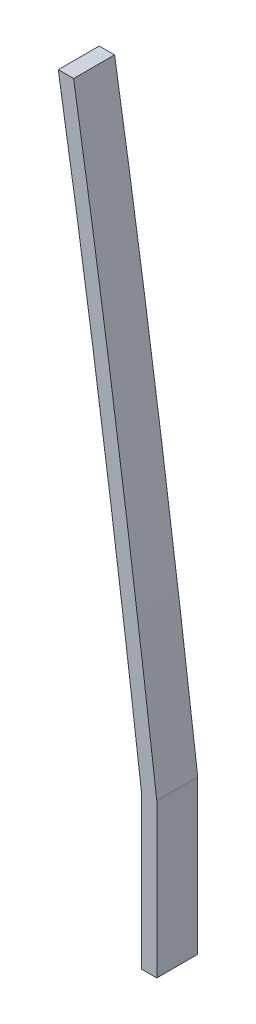
ISO-10303-21;
HEADER;
FILE_DESCRIPTION(('STEP AP214'),'2;1');
FILE_NAME('part.step','',(''),(''),'','','');
FILE_SCHEMA(('AUTOMOTIVE_DESIGN { 1 0 10303 214 1 1 1 1 }'));
ENDSEC;
DATA;
#1=APPLICATION_CONTEXT('core data for automotive mechanical design processes');
#2=APPLICATION_PROTOCOL_DEFINITION('international standard','automotive_design',2000,#1);
#3=PRODUCT_CONTEXT('',#1,'mechanical');
#4=PRODUCT('Part','Part','',(#3));
#5=PRODUCT_RELATED_PRODUCT_CATEGORY('part','',(#4));
#6=PRODUCT_DEFINITION_FORMATION('','',#4);
#7=PRODUCT_DEFINITION_CONTEXT('part definition',#1,'design');
#8=PRODUCT_DEFINITION('design','',#6,#7);
#9=PRODUCT_DEFINITION_SHAPE('','',#8);
#10=(LENGTH_UNIT() NAMED_UNIT(*) SI_UNIT(.MILLI.,.METRE.));
#11=(NAMED_UNIT(*) PLANE_ANGLE_UNIT() SI_UNIT($,.RADIAN.));
#12=(NAMED_UNIT(*) SI_UNIT($,.STERADIAN.) SOLID_ANGLE_UNIT());
#13=UNCERTAINTY_MEASURE_WITH_UNIT(LENGTH_MEASURE(1.E-05),#10,'distance_accuracy_value','');
#14=(GEOMETRIC_REPRESENTATION_CONTEXT(3) GLOBAL_UNCERTAINTY_ASSIGNED_CONTEXT((#13)) GLOBAL_UNIT_ASSIGNED_CONTEXT((#10,
#11,#12)) REPRESENTATION_CONTEXT('',''));
#15=CARTESIAN_POINT('',(0.,0.,0.));
#16=DIRECTION('',(0.,0.,1.));
#17=DIRECTION('',(1.,0.,0.));
#18=AXIS2_PLACEMENT_3D('',#15,#16,#17);
#19=CARTESIAN_POINT('',(25.9302954974501,228.6,-6.35));
#20=DIRECTION('',(0.,-1.,0.));
#21=DIRECTION('',(1.,0.,0.));
#22=AXIS2_PLACEMENT_3D('',#19,#20,#21);
#23=PLANE('',#22);
#24=DIRECTION('',(0.,0.,1.));
#25=VECTOR('',#24,1.);
#26=CARTESIAN_POINT('',(25.9302954974501,228.6,-6.35));
#27=LINE('',#26,#25);
#28=CARTESIAN_POINT('',(25.9302954974501,228.6,-6.35));
#29=VERTEX_POINT('',#28);
#30=CARTESIAN_POINT('',(25.9302954974501,228.6,6.35));
#31=VERTEX_POINT('',#30);
#32=EDGE_CURVE('E53',#29,#31,#27,.T.);
#33=ORIENTED_EDGE('',*,*,#32,.T.);
#34=DIRECTION('',(1.,0.,0.));
#35=VECTOR('',#34,1.);
#36=CARTESIAN_POINT('',(25.9302954974501,228.6,6.35));
#37=LINE('',#36,#35);
#38=CARTESIAN_POINT('',(30.6927954974501,228.599999999999,6.35));
#39=VERTEX_POINT('',#38);
#40=EDGE_CURVE('E107',#31,#39,#37,.T.);
#41=ORIENTED_EDGE('',*,*,#40,.T.);
#42=DIRECTION('',(0.,0.,1.));
#43=VECTOR('',#42,1.);
#44=CARTESIAN_POINT('',(30.6927954974501,228.599999999999,-6.35));
#45=LINE('',#44,#43);
#46=CARTESIAN_POINT('',(30.6927954974501,228.599999999999,-6.35));
#47=VERTEX_POINT('',#46);
#48=EDGE_CURVE('E11',#47,#39,#45,.T.);
#49=ORIENTED_EDGE('',*,*,#48,.F.);
#50=DIRECTION('',(1.,0.,0.));
#51=VECTOR('',#50,1.);
#52=CARTESIAN_POINT('',(25.9302954974501,228.6,-6.35));
#53=LINE('',#52,#51);
#54=EDGE_CURVE('E144',#29,#47,#53,.T.);
#55=ORIENTED_EDGE('',*,*,#54,.F.);
#56=EDGE_LOOP('',(#33,#41,#49,#55));
#57=FACE_BOUND('',#56,.T.);
#58=ADVANCED_FACE('F36',(#57),#23,.F.);
#59=CARTESIAN_POINT('',(30.6927954974501,228.599999999999,-6.35));
#60=CARTESIAN_POINT('',(32.6566719648625,216.597989750114,-6.35));
#61=CARTESIAN_POINT('',(34.55749354649,204.58565457174,-6.35));
#62=CARTESIAN_POINT('',(41.3395534973803,160.498217253722,-6.35));
#63=CARTESIAN_POINT('',(45.9079194120667,128.375397262556,-6.35));
#64=CARTESIAN_POINT('',(52.3448980047693,80.1363731610094,-6.35));
#65=CARTESIAN_POINT('',(54.4198898976329,64.0462858505826,-6.35));
#66=CARTESIAN_POINT('',(56.4410324566937,47.8408554924366,-6.35));
#67=CARTESIAN_POINT('',(56.4544908830307,47.7329227440741,-6.35));
#68=CARTESIAN_POINT('',(56.4679451043773,47.6250000000053,-6.35));
#69=B_SPLINE_CURVE_WITH_KNOTS('',3,(#59,#60,#61,#62,#63,#64,#65,#66,#67,#68),.UNSPECIFIED.,.F.,
.F.,(4,2,2,2,4),(0.15818150271673,0.194666407566278,0.291999611349417,0.340666213240986,
0.340992558934053),.UNSPECIFIED.);
#70=DIRECTION('',(0.,0.,1.));
#71=VECTOR('',#70,1.);
#72=SURFACE_OF_LINEAR_EXTRUSION('',#69,#71);
#73=ORIENTED_EDGE('',*,*,#48,.T.);
#74=CARTESIAN_POINT('',(30.6927954974501,228.599999999999,6.35));
#75=CARTESIAN_POINT('',(32.6566719648625,216.597989750114,6.35));
#76=CARTESIAN_POINT('',(34.55749354649,204.58565457174,6.35));
#77=CARTESIAN_POINT('',(41.3395534973803,160.498217253722,6.35));
#78=CARTESIAN_POINT('',(45.9079194120667,128.375397262556,6.35));
#79=CARTESIAN_POINT('',(52.3448980047693,80.1363731610094,6.35));
#80=CARTESIAN_POINT('',(54.4198898976329,64.0462858505826,6.35));
#81=CARTESIAN_POINT('',(56.4410324566937,47.8408554924366,6.35));
#82=CARTESIAN_POINT('',(56.4544908830307,47.7329227440741,6.35));
#83=CARTESIAN_POINT('',(56.4679451043773,47.6250000000053,6.35));
#84=B_SPLINE_CURVE_WITH_KNOTS('',3,(#74,#75,#76,#77,#78,#79,#80,#81,#82,#83),.UNSPECIFIED.,.F.,
.F.,(4,2,2,2,4),(0.15818150271673,0.194666407566278,0.291999611349417,0.340666213240986,
0.340992558934053),.UNSPECIFIED.);
#85=CARTESIAN_POINT('',(56.4679451043773,47.6250000000053,6.35));
#86=VERTEX_POINT('',#85);
#87=EDGE_CURVE('E95',#39,#86,#84,.T.);
#88=ORIENTED_EDGE('',*,*,#87,.T.);
#89=DIRECTION('',(0.,0.,1.));
#90=VECTOR('',#89,1.);
#91=CARTESIAN_POINT('',(56.4679451043773,47.6250000000053,-6.35));
#92=LINE('',#91,#90);
#93=CARTESIAN_POINT('',(56.4679451043773,47.6250000000053,-6.35));
#94=VERTEX_POINT('',#93);
#95=EDGE_CURVE('E45',#94,#86,#92,.T.);
#96=ORIENTED_EDGE('',*,*,#95,.F.);
#97=CARTESIAN_POINT('',(56.4679451043773,47.6250000000053,-6.35));
#98=CARTESIAN_POINT('',(56.4544908830307,47.7329227440741,-6.35));
#99=CARTESIAN_POINT('',(56.4410324566937,47.8408554924366,-6.35));
#100=CARTESIAN_POINT('',(54.4198898976329,64.0462858505826,-6.35));
#101=CARTESIAN_POINT('',(52.3448980047693,80.1363731610094,-6.35));
#102=CARTESIAN_POINT('',(45.9079194120667,128.375397262556,-6.35));
#103=CARTESIAN_POINT('',(41.3395534973803,160.498217253722,-6.35));
#104=CARTESIAN_POINT('',(34.55749354649,204.58565457174,-6.35));
#105=CARTESIAN_POINT('',(32.6566719648625,216.597989750114,-6.35));
#106=CARTESIAN_POINT('',(30.6927954974501,228.599999999999,-6.35));
#107=B_SPLINE_CURVE_WITH_KNOTS('',3,(#97,#98,#99,#100,#101,#102,#103,#104,#105,#106),
.UNSPECIFIED.,.F.,.F.,(4,2,2,2,4),(0.15818150271673,0.158507848409797,0.207174450301367,
0.304507654084505,0.340992558934053),.UNSPECIFIED.);
#108=EDGE_CURVE('E96',#47,#94,#107,.F.);
#109=ORIENTED_EDGE('',*,*,#108,.F.);
#110=EDGE_LOOP('',(#73,#88,#96,#109));
#111=FACE_BOUND('',#110,.T.);
#112=ADVANCED_FACE('F93',(#111),#72,.F.);
#113=CARTESIAN_POINT('',(56.4679451043778,47.6250000000011,-6.35));
#114=DIRECTION('',(-1.,0.,0.));
#115=DIRECTION('',(0.,-1.,0.));
#116=AXIS2_PLACEMENT_3D('',#113,#114,#115);
#117=PLANE('',#116);
#118=ORIENTED_EDGE('',*,*,#95,.T.);
#119=DIRECTION('',(0.,-1.,0.));
#120=VECTOR('',#119,1.);
#121=CARTESIAN_POINT('',(56.4679451043778,47.6250000000011,6.35));
#122=LINE('',#121,#120);
#123=CARTESIAN_POINT('',(56.4679451043779,1.06165076729781E-12,6.35));
#124=VERTEX_POINT('',#123);
#125=EDGE_CURVE('E110',#86,#124,#122,.T.);
#126=ORIENTED_EDGE('',*,*,#125,.T.);
#127=DIRECTION('',(0.,0.,1.));
#128=VECTOR('',#127,1.);
#129=CARTESIAN_POINT('',(56.4679451043779,1.06165076729781E-12,-6.35));
#130=LINE('',#129,#128);
#131=CARTESIAN_POINT('',(56.4679451043779,1.06165076729781E-12,-6.35));
#132=VERTEX_POINT('',#131);
#133=EDGE_CURVE('E157',#132,#124,#130,.T.);
#134=ORIENTED_EDGE('',*,*,#133,.F.);
#135=DIRECTION('',(0.,-1.,0.));
#136=VECTOR('',#135,1.);
#137=CARTESIAN_POINT('',(56.4679451043778,47.6250000000011,-6.35));
#138=LINE('',#137,#136);
#139=EDGE_CURVE('E160',#94,#132,#138,.T.);
#140=ORIENTED_EDGE('',*,*,#139,.F.);
#141=EDGE_LOOP('',(#118,#126,#134,#140));
#142=FACE_BOUND('',#141,.T.);
#143=ADVANCED_FACE('F136',(#142),#117,.F.);
#144=CARTESIAN_POINT('',(51.7054451043779,0.,-6.35));
#145=DIRECTION('',(2.22918796283004E-13,-1.,0.));
#146=DIRECTION('',(1.,2.22918796283004E-13,0.));
#147=AXIS2_PLACEMENT_3D('',#144,#145,#146);
#148=PLANE('',#147);
#149=ORIENTED_EDGE('',*,*,#133,.T.);
#150=DIRECTION('',(1.,2.22918796283004E-13,0.));
#151=VECTOR('',#150,1.);
#152=CARTESIAN_POINT('',(51.7054451043779,0.,6.35));
#153=LINE('',#152,#151);
#154=CARTESIAN_POINT('',(51.7054451043779,0.,6.35));
#155=VERTEX_POINT('',#154);
#156=EDGE_CURVE('E121',#155,#124,#153,.T.);
#157=ORIENTED_EDGE('',*,*,#156,.F.);
#158=DIRECTION('',(0.,0.,1.));
#159=VECTOR('',#158,1.);
#160=CARTESIAN_POINT('',(51.7054451043779,0.,-6.35));
#161=LINE('',#160,#159);
#162=CARTESIAN_POINT('',(51.7054451043779,0.,-6.35));
#163=VERTEX_POINT('',#162);
#164=EDGE_CURVE('E176',#163,#155,#161,.T.);
#165=ORIENTED_EDGE('',*,*,#164,.F.);
#166=DIRECTION('',(1.,2.22918796283004E-13,0.));
#167=VECTOR('',#166,1.);
#168=CARTESIAN_POINT('',(51.7054451043779,0.,-6.35));
#169=LINE('',#168,#167);
#170=EDGE_CURVE('E128',#163,#132,#169,.T.);
#171=ORIENTED_EDGE('',*,*,#170,.T.);
#172=EDGE_LOOP('',(#149,#157,#165,#171));
#173=FACE_BOUND('',#172,.T.);
#174=ADVANCED_FACE('F177',(#173),#148,.T.);
#175=CARTESIAN_POINT('',(51.7054451043779,47.625,-6.35));
#176=DIRECTION('',(-1.,0.,0.));
#177=DIRECTION('',(0.,0.,1.));
#178=AXIS2_PLACEMENT_3D('',#175,#176,#177);
#179=PLANE('',#178);
#180=ORIENTED_EDGE('',*,*,#164,.T.);
#181=DIRECTION('',(0.,-1.,0.));
#182=VECTOR('',#181,1.);
#183=CARTESIAN_POINT('',(51.7054451043779,47.625,6.35));
#184=LINE('',#183,#182);
#185=CARTESIAN_POINT('',(51.7054451043779,47.625,6.35));
#186=VERTEX_POINT('',#185);
#187=EDGE_CURVE('E258',#186,#155,#184,.T.);
#188=ORIENTED_EDGE('',*,*,#187,.F.);
#189=DIRECTION('',(0.,0.,1.));
#190=VECTOR('',#189,1.);
#191=CARTESIAN_POINT('',(51.7054451043779,47.625,-6.35));
#192=LINE('',#191,#190);
#193=CARTESIAN_POINT('',(51.7054451043779,47.625,-6.35));
#194=VERTEX_POINT('',#193);
#195=EDGE_CURVE('E61',#194,#186,#192,.T.);
#196=ORIENTED_EDGE('',*,*,#195,.F.);
#197=DIRECTION('',(0.,-1.,0.));
#198=VECTOR('',#197,1.);
#199=CARTESIAN_POINT('',(51.7054451043779,47.625,-6.35));
#200=LINE('',#199,#198);
#201=EDGE_CURVE('E168',#194,#163,#200,.T.);
#202=ORIENTED_EDGE('',*,*,#201,.T.);
#203=EDGE_LOOP('',(#180,#188,#196,#202));
#204=FACE_BOUND('',#203,.T.);
#205=ADVANCED_FACE('F178',(#204),#179,.T.);
#206=CARTESIAN_POINT('',(25.9302954974501,228.6,-6.35));
#207=CARTESIAN_POINT('',(28.8351105870583,210.988612905842,-6.35));
#208=CARTESIAN_POINT('',(34.3584971117847,175.720617460508,-6.35));
#209=CARTESIAN_POINT('',(40.710566339886,131.542229957257,-6.35));
#210=CARTESIAN_POINT('',(45.5050338004781,96.1603679736256,-6.35));
#211=CARTESIAN_POINT('',(48.3893300350546,74.0254637822379,-6.35));
#212=CARTESIAN_POINT('',(50.3488867499652,58.5338769567341,-6.35));
#213=CARTESIAN_POINT('',(51.2613298012352,51.2132218332317,-6.35));
#214=CARTESIAN_POINT('',(51.6211130818759,48.3072004728878,-6.35));
#215=CARTESIAN_POINT('',(51.7054451043779,47.625,-6.35));
#216=B_SPLINE_CURVE_WITH_KNOTS('',3,(#206,#207,#208,#209,#210,#211,#212,#213,#214,#215),
.UNSPECIFIED.,.F.,.F.,(4,1,1,1,1,1,1,4),(0.158553363558119,0.216147542239911,0.273741720921704,
0.3025388102626,0.331335899603497,0.345734444273945,0.352933716609169,0.355143131115409),.UNSPECIFIED.);
#217=DIRECTION('',(0.,0.,1.));
#218=VECTOR('',#217,1.);
#219=SURFACE_OF_LINEAR_EXTRUSION('',#216,#218);
#220=ORIENTED_EDGE('',*,*,#195,.T.);
#221=CARTESIAN_POINT('',(25.9302954974501,228.6,6.35));
#222=CARTESIAN_POINT('',(28.8351105870583,210.988612905842,6.35));
#223=CARTESIAN_POINT('',(34.3584971117847,175.720617460508,6.35));
#224=CARTESIAN_POINT('',(40.710566339886,131.542229957257,6.35));
#225=CARTESIAN_POINT('',(45.5050338004781,96.1603679736256,6.35));
#226=CARTESIAN_POINT('',(48.3893300350546,74.0254637822379,6.35));
#227=CARTESIAN_POINT('',(50.3488867499652,58.5338769567341,6.35));
#228=CARTESIAN_POINT('',(51.2613298012352,51.2132218332317,6.35));
#229=CARTESIAN_POINT('',(51.6211130818759,48.3072004728878,6.35));
#230=CARTESIAN_POINT('',(51.7054451043779,47.625,6.35));
#231=B_SPLINE_CURVE_WITH_KNOTS('',3,(#221,#222,#223,#224,#225,#226,#227,#228,#229,#230),
.UNSPECIFIED.,.F.,.F.,(4,1,1,1,1,1,1,4),(0.158553363558119,0.216147542239911,0.273741720921704,
0.3025388102626,0.331335899603497,0.345734444273945,0.352933716609169,0.355143131115409),.UNSPECIFIED.);
#232=EDGE_CURVE('E151',#31,#186,#231,.T.);
#233=ORIENTED_EDGE('',*,*,#232,.F.);
#234=ORIENTED_EDGE('',*,*,#32,.F.);
#235=EDGE_CURVE('E180',#29,#194,#216,.T.);
#236=ORIENTED_EDGE('',*,*,#235,.T.);
#237=EDGE_LOOP('',(#220,#233,#234,#236));
#238=FACE_BOUND('',#237,.T.);
#239=ADVANCED_FACE('F191',(#238),#219,.T.);
#240=CARTESIAN_POINT('',(44.4244034204062,138.233609655327,-6.35));
#241=DIRECTION('',(0.,0.,1.));
#242=DIRECTION('',(1.,0.,0.));
#243=AXIS2_PLACEMENT_3D('',#240,#241,#242);
#244=PLANE('',#243);
#245=ORIENTED_EDGE('',*,*,#54,.T.);
#246=ORIENTED_EDGE('',*,*,#108,.T.);
#247=ORIENTED_EDGE('',*,*,#139,.T.);
#248=ORIENTED_EDGE('',*,*,#170,.F.);
#249=ORIENTED_EDGE('',*,*,#201,.F.);
#250=ORIENTED_EDGE('',*,*,#235,.F.);
#251=EDGE_LOOP('',(#245,#246,#247,#248,#249,#250));
#252=FACE_BOUND('',#251,.T.);
#253=ADVANCED_FACE('F170',(#252),#244,.F.);
#254=CARTESIAN_POINT('',(44.4244034204062,138.233609655327,6.35));
#255=DIRECTION('',(0.,0.,1.));
#256=DIRECTION('',(1.,0.,0.));
#257=AXIS2_PLACEMENT_3D('',#254,#255,#256);
#258=PLANE('',#257);
#259=ORIENTED_EDGE('',*,*,#40,.F.);
#260=ORIENTED_EDGE('',*,*,#232,.T.);
#261=ORIENTED_EDGE('',*,*,#187,.T.);
#262=ORIENTED_EDGE('',*,*,#156,.T.);
#263=ORIENTED_EDGE('',*,*,#125,.F.);
#264=ORIENTED_EDGE('',*,*,#87,.F.);
#265=EDGE_LOOP('',(#259,#260,#261,#262,#263,#264));
#266=FACE_BOUND('',#265,.T.);
#267=ADVANCED_FACE('F105',(#266),#258,.T.);
#268=CLOSED_SHELL('',(#58,#112,#143,#174,#205,#239,#253,#267));
#269=MANIFOLD_SOLID_BREP('B2',#268);
#270=ADVANCED_BREP_SHAPE_REPRESENTATION('',(#18,#269),#14);
#271=SHAPE_DEFINITION_REPRESENTATION(#9,#270);
ENDSEC;
END-ISO-10303-21;
